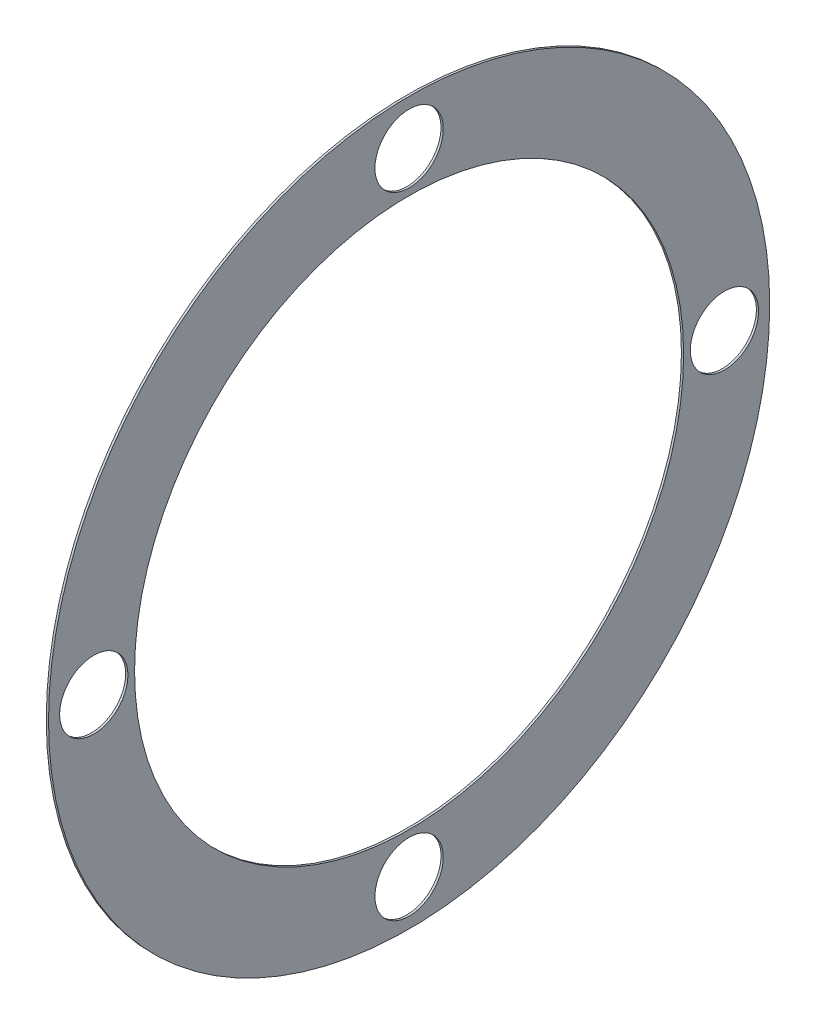
ISO-10303-21;
HEADER;
FILE_DESCRIPTION(('STEP AP214'),'2;1');
FILE_NAME('part.step','',(''),(''),'','','');
FILE_SCHEMA(('AUTOMOTIVE_DESIGN { 1 0 10303 214 1 1 1 1 }'));
ENDSEC;
DATA;
#1=APPLICATION_CONTEXT('core data for automotive mechanical design processes');
#2=APPLICATION_PROTOCOL_DEFINITION('international standard','automotive_design',2000,#1);
#3=PRODUCT_CONTEXT('',#1,'mechanical');
#4=PRODUCT('Part','Part','',(#3));
#5=PRODUCT_RELATED_PRODUCT_CATEGORY('part','',(#4));
#6=PRODUCT_DEFINITION_FORMATION('','',#4);
#7=PRODUCT_DEFINITION_CONTEXT('part definition',#1,'design');
#8=PRODUCT_DEFINITION('design','',#6,#7);
#9=PRODUCT_DEFINITION_SHAPE('','',#8);
#10=(LENGTH_UNIT() NAMED_UNIT(*) SI_UNIT(.MILLI.,.METRE.));
#11=(NAMED_UNIT(*) PLANE_ANGLE_UNIT() SI_UNIT($,.RADIAN.));
#12=(NAMED_UNIT(*) SI_UNIT($,.STERADIAN.) SOLID_ANGLE_UNIT());
#13=UNCERTAINTY_MEASURE_WITH_UNIT(LENGTH_MEASURE(1.E-05),#10,'distance_accuracy_value','');
#14=(GEOMETRIC_REPRESENTATION_CONTEXT(3) GLOBAL_UNCERTAINTY_ASSIGNED_CONTEXT((#13)) GLOBAL_UNIT_ASSIGNED_CONTEXT((#10,
#11,#12)) REPRESENTATION_CONTEXT('',''));
#15=CARTESIAN_POINT('',(0.,0.,0.));
#16=DIRECTION('',(0.,0.,1.));
#17=DIRECTION('',(1.,0.,0.));
#18=AXIS2_PLACEMENT_3D('',#15,#16,#17);
#19=CARTESIAN_POINT('',(0.,0.,0.));
#20=DIRECTION('',(1.,0.,0.));
#21=DIRECTION('',(0.,0.,-1.));
#22=AXIS2_PLACEMENT_3D('',#19,#20,#21);
#23=PLANE('',#22);
#24=CARTESIAN_POINT('',(0.,0.,0.));
#25=DIRECTION('',(1.,0.,0.));
#26=DIRECTION('',(0.,0.,-1.));
#27=AXIS2_PLACEMENT_3D('',#24,#25,#26);
#28=CIRCLE('',#27,24.3);
#29=CARTESIAN_POINT('',(0.,0.,-24.3));
#30=VERTEX_POINT('',#29);
#31=EDGE_CURVE('E41',#30,#30,#28,.F.);
#32=ORIENTED_EDGE('',*,*,#31,.F.);
#33=EDGE_LOOP('',(#32));
#34=FACE_BOUND('',#33,.T.);
#35=CARTESIAN_POINT('',(0.,0.,-21.25));
#36=DIRECTION('',(-1.,0.,0.));
#37=DIRECTION('',(0.,0.,1.));
#38=AXIS2_PLACEMENT_3D('',#35,#36,#37);
#39=CIRCLE('',#38,2.3);
#40=CARTESIAN_POINT('',(0.,0.,-18.95));
#41=VERTEX_POINT('',#40);
#42=EDGE_CURVE('E44',#41,#41,#39,.T.);
#43=ORIENTED_EDGE('',*,*,#42,.T.);
#44=EDGE_LOOP('',(#43));
#45=FACE_BOUND('',#44,.T.);
#46=CARTESIAN_POINT('',(0.,-21.25,0.));
#47=DIRECTION('',(-1.,0.,0.));
#48=DIRECTION('',(0.,0.,1.));
#49=AXIS2_PLACEMENT_3D('',#46,#47,#48);
#50=CIRCLE('',#49,2.3);
#51=CARTESIAN_POINT('',(0.,-21.25,2.3));
#52=VERTEX_POINT('',#51);
#53=EDGE_CURVE('E47',#52,#52,#50,.T.);
#54=ORIENTED_EDGE('',*,*,#53,.T.);
#55=EDGE_LOOP('',(#54));
#56=FACE_BOUND('',#55,.T.);
#57=CARTESIAN_POINT('',(0.,0.,21.25));
#58=DIRECTION('',(-1.,0.,0.));
#59=DIRECTION('',(0.,0.,1.));
#60=AXIS2_PLACEMENT_3D('',#57,#58,#59);
#61=CIRCLE('',#60,2.3);
#62=CARTESIAN_POINT('',(0.,0.,23.55));
#63=VERTEX_POINT('',#62);
#64=EDGE_CURVE('E50',#63,#63,#61,.T.);
#65=ORIENTED_EDGE('',*,*,#64,.T.);
#66=EDGE_LOOP('',(#65));
#67=FACE_BOUND('',#66,.T.);
#68=CARTESIAN_POINT('',(0.,0.,0.));
#69=DIRECTION('',(1.,0.,0.));
#70=DIRECTION('',(0.,0.,-1.));
#71=AXIS2_PLACEMENT_3D('',#68,#69,#70);
#72=CIRCLE('',#71,18.5);
#73=CARTESIAN_POINT('',(0.,0.,-18.5));
#74=VERTEX_POINT('',#73);
#75=EDGE_CURVE('E52',#74,#74,#72,.F.);
#76=ORIENTED_EDGE('',*,*,#75,.T.);
#77=EDGE_LOOP('',(#76));
#78=FACE_BOUND('',#77,.T.);
#79=CARTESIAN_POINT('',(0.,21.25,0.));
#80=DIRECTION('',(-1.,0.,0.));
#81=DIRECTION('',(0.,0.,1.));
#82=AXIS2_PLACEMENT_3D('',#79,#80,#81);
#83=CIRCLE('',#82,2.3);
#84=CARTESIAN_POINT('',(0.,21.25,2.3));
#85=VERTEX_POINT('',#84);
#86=EDGE_CURVE('E18',#85,#85,#83,.T.);
#87=ORIENTED_EDGE('',*,*,#86,.T.);
#88=EDGE_LOOP('',(#87));
#89=FACE_BOUND('',#88,.T.);
#90=ADVANCED_FACE('F15',(#34,#45,#56,#67,#78,#89),#23,.T.);
#91=CARTESIAN_POINT('',(0.,21.25,0.));
#92=DIRECTION('',(-1.,0.,0.));
#93=DIRECTION('',(0.,0.,1.));
#94=AXIS2_PLACEMENT_3D('',#91,#92,#93);
#95=CYLINDRICAL_SURFACE('',#94,2.3);
#96=ORIENTED_EDGE('',*,*,#86,.F.);
#97=EDGE_LOOP('',(#96));
#98=FACE_BOUND('',#97,.T.);
#99=CARTESIAN_POINT('',(-0.15,21.25,0.));
#100=DIRECTION('',(-1.,0.,0.));
#101=DIRECTION('',(0.,0.,1.));
#102=AXIS2_PLACEMENT_3D('',#99,#100,#101);
#103=CIRCLE('',#102,2.3);
#104=CARTESIAN_POINT('',(-0.15,21.25,2.3));
#105=VERTEX_POINT('',#104);
#106=EDGE_CURVE('E38',#105,#105,#103,.T.);
#107=ORIENTED_EDGE('',*,*,#106,.T.);
#108=EDGE_LOOP('',(#107));
#109=FACE_BOUND('',#108,.T.);
#110=ADVANCED_FACE('F60',(#98,#109),#95,.F.);
#111=CARTESIAN_POINT('',(-0.1575,0.,0.));
#112=DIRECTION('',(1.,0.,0.));
#113=DIRECTION('',(0.,0.,-1.));
#114=AXIS2_PLACEMENT_3D('',#111,#112,#113);
#115=CYLINDRICAL_SURFACE('',#114,18.5);
#116=ORIENTED_EDGE('',*,*,#75,.F.);
#117=EDGE_LOOP('',(#116));
#118=FACE_BOUND('',#117,.T.);
#119=CARTESIAN_POINT('',(-0.15,0.,0.));
#120=DIRECTION('',(1.,0.,0.));
#121=DIRECTION('',(0.,0.,-1.));
#122=AXIS2_PLACEMENT_3D('',#119,#120,#121);
#123=CIRCLE('',#122,18.5);
#124=CARTESIAN_POINT('',(-0.15,0.,-18.5));
#125=VERTEX_POINT('',#124);
#126=EDGE_CURVE('E35',#125,#125,#123,.F.);
#127=ORIENTED_EDGE('',*,*,#126,.T.);
#128=EDGE_LOOP('',(#127));
#129=FACE_BOUND('',#128,.T.);
#130=ADVANCED_FACE('F63',(#118,#129),#115,.F.);
#131=CARTESIAN_POINT('',(0.,0.,21.25));
#132=DIRECTION('',(-1.,0.,0.));
#133=DIRECTION('',(0.,0.,1.));
#134=AXIS2_PLACEMENT_3D('',#131,#132,#133);
#135=CYLINDRICAL_SURFACE('',#134,2.3);
#136=ORIENTED_EDGE('',*,*,#64,.F.);
#137=EDGE_LOOP('',(#136));
#138=FACE_BOUND('',#137,.T.);
#139=CARTESIAN_POINT('',(-0.15,0.,21.25));
#140=DIRECTION('',(-1.,0.,0.));
#141=DIRECTION('',(0.,0.,1.));
#142=AXIS2_PLACEMENT_3D('',#139,#140,#141);
#143=CIRCLE('',#142,2.3);
#144=CARTESIAN_POINT('',(-0.15,0.,23.55));
#145=VERTEX_POINT('',#144);
#146=EDGE_CURVE('E32',#145,#145,#143,.T.);
#147=ORIENTED_EDGE('',*,*,#146,.T.);
#148=EDGE_LOOP('',(#147));
#149=FACE_BOUND('',#148,.T.);
#150=ADVANCED_FACE('F86',(#138,#149),#135,.F.);
#151=CARTESIAN_POINT('',(0.,-21.25,0.));
#152=DIRECTION('',(-1.,0.,0.));
#153=DIRECTION('',(0.,0.,1.));
#154=AXIS2_PLACEMENT_3D('',#151,#152,#153);
#155=CYLINDRICAL_SURFACE('',#154,2.3);
#156=ORIENTED_EDGE('',*,*,#53,.F.);
#157=EDGE_LOOP('',(#156));
#158=FACE_BOUND('',#157,.T.);
#159=CARTESIAN_POINT('',(-0.15,-21.25,0.));
#160=DIRECTION('',(-1.,0.,0.));
#161=DIRECTION('',(0.,0.,1.));
#162=AXIS2_PLACEMENT_3D('',#159,#160,#161);
#163=CIRCLE('',#162,2.3);
#164=CARTESIAN_POINT('',(-0.15,-21.25,2.3));
#165=VERTEX_POINT('',#164);
#166=EDGE_CURVE('E27',#165,#165,#163,.T.);
#167=ORIENTED_EDGE('',*,*,#166,.T.);
#168=EDGE_LOOP('',(#167));
#169=FACE_BOUND('',#168,.T.);
#170=ADVANCED_FACE('F82',(#158,#169),#155,.F.);
#171=CARTESIAN_POINT('',(0.,0.,-21.25));
#172=DIRECTION('',(-1.,0.,0.));
#173=DIRECTION('',(0.,0.,1.));
#174=AXIS2_PLACEMENT_3D('',#171,#172,#173);
#175=CYLINDRICAL_SURFACE('',#174,2.3);
#176=ORIENTED_EDGE('',*,*,#42,.F.);
#177=EDGE_LOOP('',(#176));
#178=FACE_BOUND('',#177,.T.);
#179=CARTESIAN_POINT('',(-0.15,0.,-21.25));
#180=DIRECTION('',(-1.,0.,0.));
#181=DIRECTION('',(0.,0.,1.));
#182=AXIS2_PLACEMENT_3D('',#179,#180,#181);
#183=CIRCLE('',#182,2.3);
#184=CARTESIAN_POINT('',(-0.15,0.,-18.95));
#185=VERTEX_POINT('',#184);
#186=EDGE_CURVE('E22',#185,#185,#183,.T.);
#187=ORIENTED_EDGE('',*,*,#186,.T.);
#188=EDGE_LOOP('',(#187));
#189=FACE_BOUND('',#188,.T.);
#190=ADVANCED_FACE('F75',(#178,#189),#175,.F.);
#191=CARTESIAN_POINT('',(-0.1575,0.,0.));
#192=DIRECTION('',(1.,0.,0.));
#193=DIRECTION('',(0.,0.,-1.));
#194=AXIS2_PLACEMENT_3D('',#191,#192,#193);
#195=CYLINDRICAL_SURFACE('',#194,24.3);
#196=ORIENTED_EDGE('',*,*,#31,.T.);
#197=EDGE_LOOP('',(#196));
#198=FACE_BOUND('',#197,.T.);
#199=CARTESIAN_POINT('',(-0.15,0.,0.));
#200=DIRECTION('',(1.,0.,0.));
#201=DIRECTION('',(0.,0.,-1.));
#202=AXIS2_PLACEMENT_3D('',#199,#200,#201);
#203=CIRCLE('',#202,24.3);
#204=CARTESIAN_POINT('',(-0.15,0.,-24.3));
#205=VERTEX_POINT('',#204);
#206=EDGE_CURVE('E10',#205,#205,#203,.T.);
#207=ORIENTED_EDGE('',*,*,#206,.T.);
#208=EDGE_LOOP('',(#207));
#209=FACE_BOUND('',#208,.T.);
#210=ADVANCED_FACE('F68',(#198,#209),#195,.T.);
#211=CARTESIAN_POINT('',(-0.15,0.,0.));
#212=DIRECTION('',(1.,0.,0.));
#213=DIRECTION('',(0.,0.,-1.));
#214=AXIS2_PLACEMENT_3D('',#211,#212,#213);
#215=PLANE('',#214);
#216=ORIENTED_EDGE('',*,*,#206,.F.);
#217=EDGE_LOOP('',(#216));
#218=FACE_BOUND('',#217,.T.);
#219=ORIENTED_EDGE('',*,*,#186,.F.);
#220=EDGE_LOOP('',(#219));
#221=FACE_BOUND('',#220,.T.);
#222=ORIENTED_EDGE('',*,*,#166,.F.);
#223=EDGE_LOOP('',(#222));
#224=FACE_BOUND('',#223,.T.);
#225=ORIENTED_EDGE('',*,*,#146,.F.);
#226=EDGE_LOOP('',(#225));
#227=FACE_BOUND('',#226,.T.);
#228=ORIENTED_EDGE('',*,*,#126,.F.);
#229=EDGE_LOOP('',(#228));
#230=FACE_BOUND('',#229,.T.);
#231=ORIENTED_EDGE('',*,*,#106,.F.);
#232=EDGE_LOOP('',(#231));
#233=FACE_BOUND('',#232,.T.);
#234=ADVANCED_FACE('F66',(#218,#221,#224,#227,#230,#233),#215,.F.);
#235=CLOSED_SHELL('',(#90,#110,#130,#150,#170,#190,#210,#234));
#236=MANIFOLD_SOLID_BREP('B1',#235);
#237=ADVANCED_BREP_SHAPE_REPRESENTATION('',(#18,#236),#14);
#238=SHAPE_DEFINITION_REPRESENTATION(#9,#237);
ENDSEC;
END-ISO-10303-21;
